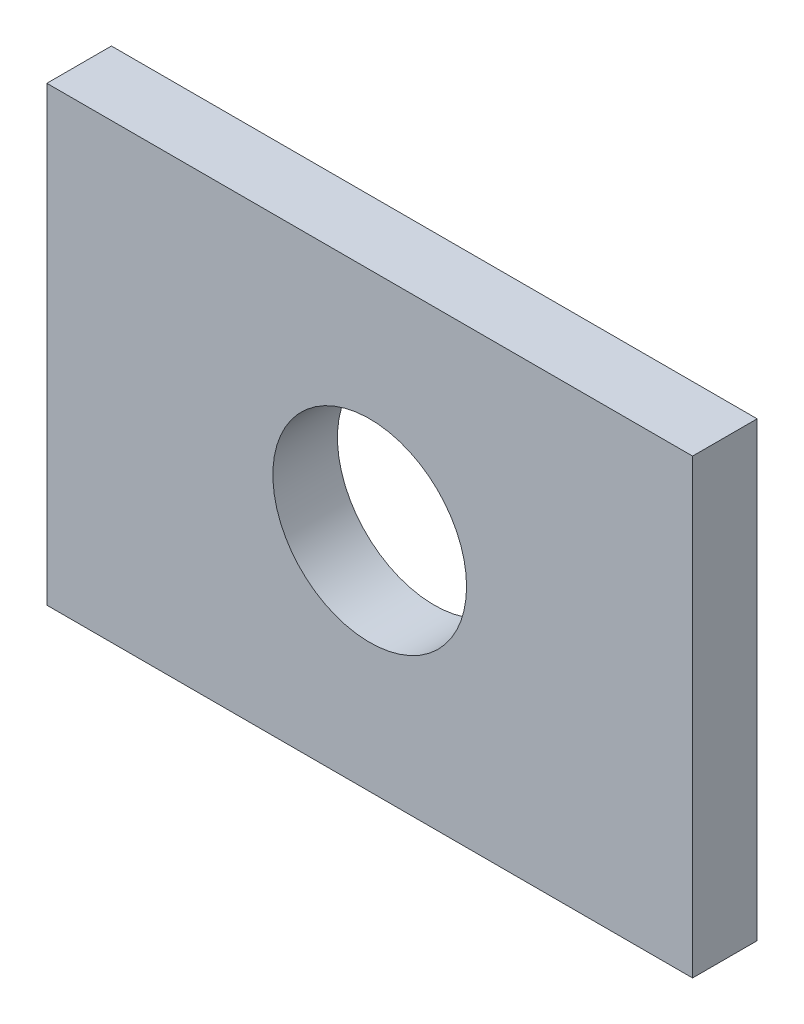
ISO-10303-21;
HEADER;
FILE_DESCRIPTION(('STEP AP214'),'2;1');
FILE_NAME('part.step','',(''),(''),'','','');
FILE_SCHEMA(('AUTOMOTIVE_DESIGN { 1 0 10303 214 1 1 1 1 }'));
ENDSEC;
DATA;
#1=APPLICATION_CONTEXT('core data for automotive mechanical design processes');
#2=APPLICATION_PROTOCOL_DEFINITION('international standard','automotive_design',2000,#1);
#3=PRODUCT_CONTEXT('',#1,'mechanical');
#4=PRODUCT('Part','Part','',(#3));
#5=PRODUCT_RELATED_PRODUCT_CATEGORY('part','',(#4));
#6=PRODUCT_DEFINITION_FORMATION('','',#4);
#7=PRODUCT_DEFINITION_CONTEXT('part definition',#1,'design');
#8=PRODUCT_DEFINITION('design','',#6,#7);
#9=PRODUCT_DEFINITION_SHAPE('','',#8);
#10=(LENGTH_UNIT() NAMED_UNIT(*) SI_UNIT(.MILLI.,.METRE.));
#11=(NAMED_UNIT(*) PLANE_ANGLE_UNIT() SI_UNIT($,.RADIAN.));
#12=(NAMED_UNIT(*) SI_UNIT($,.STERADIAN.) SOLID_ANGLE_UNIT());
#13=UNCERTAINTY_MEASURE_WITH_UNIT(LENGTH_MEASURE(1.E-05),#10,'distance_accuracy_value','');
#14=(GEOMETRIC_REPRESENTATION_CONTEXT(3) GLOBAL_UNCERTAINTY_ASSIGNED_CONTEXT((#13)) GLOBAL_UNIT_ASSIGNED_CONTEXT((#10,
#11,#12)) REPRESENTATION_CONTEXT('',''));
#15=CARTESIAN_POINT('',(0.,0.,0.));
#16=DIRECTION('',(0.,0.,1.));
#17=DIRECTION('',(1.,0.,0.));
#18=AXIS2_PLACEMENT_3D('',#15,#16,#17);
#19=CARTESIAN_POINT('',(0.,0.,1.));
#20=DIRECTION('',(0.,0.,1.));
#21=DIRECTION('',(1.,0.,0.));
#22=AXIS2_PLACEMENT_3D('',#19,#20,#21);
#23=PLANE('',#22);
#24=DIRECTION('',(0.,1.,0.));
#25=VECTOR('',#24,1.);
#26=CARTESIAN_POINT('',(5.,3.5,1.));
#27=LINE('',#26,#25);
#28=CARTESIAN_POINT('',(5.,-3.5,1.));
#29=VERTEX_POINT('',#28);
#30=CARTESIAN_POINT('',(5.,3.5,1.));
#31=VERTEX_POINT('',#30);
#32=EDGE_CURVE('E93',#29,#31,#27,.T.);
#33=ORIENTED_EDGE('',*,*,#32,.T.);
#34=DIRECTION('',(-1.,0.,0.));
#35=VECTOR('',#34,1.);
#36=CARTESIAN_POINT('',(-5.,3.5,1.));
#37=LINE('',#36,#35);
#38=CARTESIAN_POINT('',(-5.,3.5,1.));
#39=VERTEX_POINT('',#38);
#40=EDGE_CURVE('E88',#31,#39,#37,.T.);
#41=ORIENTED_EDGE('',*,*,#40,.T.);
#42=DIRECTION('',(0.,-1.,0.));
#43=VECTOR('',#42,1.);
#44=CARTESIAN_POINT('',(-5.,3.5,1.));
#45=LINE('',#44,#43);
#46=CARTESIAN_POINT('',(-5.,-3.5,1.));
#47=VERTEX_POINT('',#46);
#48=EDGE_CURVE('E91',#39,#47,#45,.T.);
#49=ORIENTED_EDGE('',*,*,#48,.T.);
#50=DIRECTION('',(1.,0.,0.));
#51=VECTOR('',#50,1.);
#52=CARTESIAN_POINT('',(-5.,-3.5,1.));
#53=LINE('',#52,#51);
#54=EDGE_CURVE('E58',#47,#29,#53,.T.);
#55=ORIENTED_EDGE('',*,*,#54,.T.);
#56=EDGE_LOOP('',(#33,#41,#49,#55));
#57=FACE_BOUND('',#56,.T.);
#58=CARTESIAN_POINT('',(0.,0.,1.));
#59=DIRECTION('',(0.,0.,1.));
#60=DIRECTION('',(1.,0.,0.));
#61=AXIS2_PLACEMENT_3D('',#58,#59,#60);
#62=CIRCLE('',#61,1.5);
#63=CARTESIAN_POINT('',(1.5,0.,1.));
#64=VERTEX_POINT('',#63);
#65=EDGE_CURVE('E108',#64,#64,#62,.T.);
#66=ORIENTED_EDGE('',*,*,#65,.F.);
#67=EDGE_LOOP('',(#66));
#68=FACE_BOUND('',#67,.T.);
#69=ADVANCED_FACE('F41',(#57,#68),#23,.T.);
#70=CARTESIAN_POINT('',(0.,0.,0.));
#71=DIRECTION('',(0.,0.,1.));
#72=DIRECTION('',(1.,0.,0.));
#73=AXIS2_PLACEMENT_3D('',#70,#71,#72);
#74=PLANE('',#73);
#75=DIRECTION('',(0.,1.,0.));
#76=VECTOR('',#75,1.);
#77=CARTESIAN_POINT('',(5.,3.5,0.));
#78=LINE('',#77,#76);
#79=CARTESIAN_POINT('',(5.,-3.5,0.));
#80=VERTEX_POINT('',#79);
#81=CARTESIAN_POINT('',(5.,3.5,0.));
#82=VERTEX_POINT('',#81);
#83=EDGE_CURVE('E105',#80,#82,#78,.T.);
#84=ORIENTED_EDGE('',*,*,#83,.F.);
#85=DIRECTION('',(1.,0.,0.));
#86=VECTOR('',#85,1.);
#87=CARTESIAN_POINT('',(-5.,-3.5,0.));
#88=LINE('',#87,#86);
#89=CARTESIAN_POINT('',(-5.,-3.5,0.));
#90=VERTEX_POINT('',#89);
#91=EDGE_CURVE('E81',#90,#80,#88,.T.);
#92=ORIENTED_EDGE('',*,*,#91,.F.);
#93=DIRECTION('',(0.,-1.,0.));
#94=VECTOR('',#93,1.);
#95=CARTESIAN_POINT('',(-5.,3.5,0.));
#96=LINE('',#95,#94);
#97=CARTESIAN_POINT('',(-5.,3.5,0.));
#98=VERTEX_POINT('',#97);
#99=EDGE_CURVE('E75',#98,#90,#96,.T.);
#100=ORIENTED_EDGE('',*,*,#99,.F.);
#101=DIRECTION('',(-1.,0.,0.));
#102=VECTOR('',#101,1.);
#103=CARTESIAN_POINT('',(-5.,3.5,0.));
#104=LINE('',#103,#102);
#105=EDGE_CURVE('E97',#82,#98,#104,.T.);
#106=ORIENTED_EDGE('',*,*,#105,.F.);
#107=EDGE_LOOP('',(#84,#92,#100,#106));
#108=FACE_BOUND('',#107,.T.);
#109=CARTESIAN_POINT('',(0.,0.,0.));
#110=DIRECTION('',(0.,0.,1.));
#111=DIRECTION('',(1.,0.,0.));
#112=AXIS2_PLACEMENT_3D('',#109,#110,#111);
#113=CIRCLE('',#112,1.5);
#114=CARTESIAN_POINT('',(1.5,0.,0.));
#115=VERTEX_POINT('',#114);
#116=EDGE_CURVE('E120',#115,#115,#113,.T.);
#117=ORIENTED_EDGE('',*,*,#116,.T.);
#118=EDGE_LOOP('',(#117));
#119=FACE_BOUND('',#118,.T.);
#120=ADVANCED_FACE('F116',(#108,#119),#74,.F.);
#121=CARTESIAN_POINT('',(5.,3.5,1.));
#122=DIRECTION('',(-1.,0.,0.));
#123=DIRECTION('',(0.,-1.,0.));
#124=AXIS2_PLACEMENT_3D('',#121,#122,#123);
#125=PLANE('',#124);
#126=ORIENTED_EDGE('',*,*,#83,.T.);
#127=DIRECTION('',(0.,0.,-1.));
#128=VECTOR('',#127,1.);
#129=CARTESIAN_POINT('',(5.,3.5,1.));
#130=LINE('',#129,#128);
#131=EDGE_CURVE('E11',#31,#82,#130,.T.);
#132=ORIENTED_EDGE('',*,*,#131,.F.);
#133=ORIENTED_EDGE('',*,*,#32,.F.);
#134=DIRECTION('',(0.,0.,-1.));
#135=VECTOR('',#134,1.);
#136=CARTESIAN_POINT('',(5.,-3.5,1.));
#137=LINE('',#136,#135);
#138=EDGE_CURVE('E101',#29,#80,#137,.T.);
#139=ORIENTED_EDGE('',*,*,#138,.T.);
#140=EDGE_LOOP('',(#126,#132,#133,#139));
#141=FACE_BOUND('',#140,.T.);
#142=ADVANCED_FACE('F43',(#141),#125,.F.);
#143=CARTESIAN_POINT('',(-5.,3.5,1.));
#144=DIRECTION('',(0.,-1.,0.));
#145=DIRECTION('',(0.,0.,-1.));
#146=AXIS2_PLACEMENT_3D('',#143,#144,#145);
#147=PLANE('',#146);
#148=ORIENTED_EDGE('',*,*,#105,.T.);
#149=DIRECTION('',(0.,0.,-1.));
#150=VECTOR('',#149,1.);
#151=CARTESIAN_POINT('',(-5.,3.5,1.));
#152=LINE('',#151,#150);
#153=EDGE_CURVE('E50',#39,#98,#152,.T.);
#154=ORIENTED_EDGE('',*,*,#153,.F.);
#155=ORIENTED_EDGE('',*,*,#40,.F.);
#156=ORIENTED_EDGE('',*,*,#131,.T.);
#157=EDGE_LOOP('',(#148,#154,#155,#156));
#158=FACE_BOUND('',#157,.T.);
#159=ADVANCED_FACE('F96',(#158),#147,.F.);
#160=CARTESIAN_POINT('',(-5.,3.5,1.));
#161=DIRECTION('',(1.,0.,0.));
#162=DIRECTION('',(0.,0.,-1.));
#163=AXIS2_PLACEMENT_3D('',#160,#161,#162);
#164=PLANE('',#163);
#165=ORIENTED_EDGE('',*,*,#99,.T.);
#166=DIRECTION('',(0.,0.,-1.));
#167=VECTOR('',#166,1.);
#168=CARTESIAN_POINT('',(-5.,-3.5,1.));
#169=LINE('',#168,#167);
#170=EDGE_CURVE('E98',#47,#90,#169,.T.);
#171=ORIENTED_EDGE('',*,*,#170,.F.);
#172=ORIENTED_EDGE('',*,*,#48,.F.);
#173=ORIENTED_EDGE('',*,*,#153,.T.);
#174=EDGE_LOOP('',(#165,#171,#172,#173));
#175=FACE_BOUND('',#174,.T.);
#176=ADVANCED_FACE('F99',(#175),#164,.F.);
#177=CARTESIAN_POINT('',(-5.,-3.5,1.));
#178=DIRECTION('',(0.,1.,0.));
#179=DIRECTION('',(0.,0.,1.));
#180=AXIS2_PLACEMENT_3D('',#177,#178,#179);
#181=PLANE('',#180);
#182=ORIENTED_EDGE('',*,*,#91,.T.);
#183=ORIENTED_EDGE('',*,*,#138,.F.);
#184=ORIENTED_EDGE('',*,*,#54,.F.);
#185=ORIENTED_EDGE('',*,*,#170,.T.);
#186=EDGE_LOOP('',(#182,#183,#184,#185));
#187=FACE_BOUND('',#186,.T.);
#188=ADVANCED_FACE('F113',(#187),#181,.F.);
#189=CARTESIAN_POINT('',(0.,0.,1.));
#190=DIRECTION('',(0.,0.,-1.));
#191=DIRECTION('',(-1.,0.,0.));
#192=AXIS2_PLACEMENT_3D('',#189,#190,#191);
#193=CYLINDRICAL_SURFACE('',#192,1.5);
#194=ORIENTED_EDGE('',*,*,#65,.T.);
#195=EDGE_LOOP('',(#194));
#196=FACE_BOUND('',#195,.T.);
#197=ORIENTED_EDGE('',*,*,#116,.F.);
#198=EDGE_LOOP('',(#197));
#199=FACE_BOUND('',#198,.T.);
#200=ADVANCED_FACE('F126',(#196,#199),#193,.F.);
#201=CLOSED_SHELL('',(#69,#120,#142,#159,#176,#188,#200));
#202=MANIFOLD_SOLID_BREP('B2',#201);
#203=ADVANCED_BREP_SHAPE_REPRESENTATION('',(#18,#202),#14);
#204=SHAPE_DEFINITION_REPRESENTATION(#9,#203);
ENDSEC;
END-ISO-10303-21;
